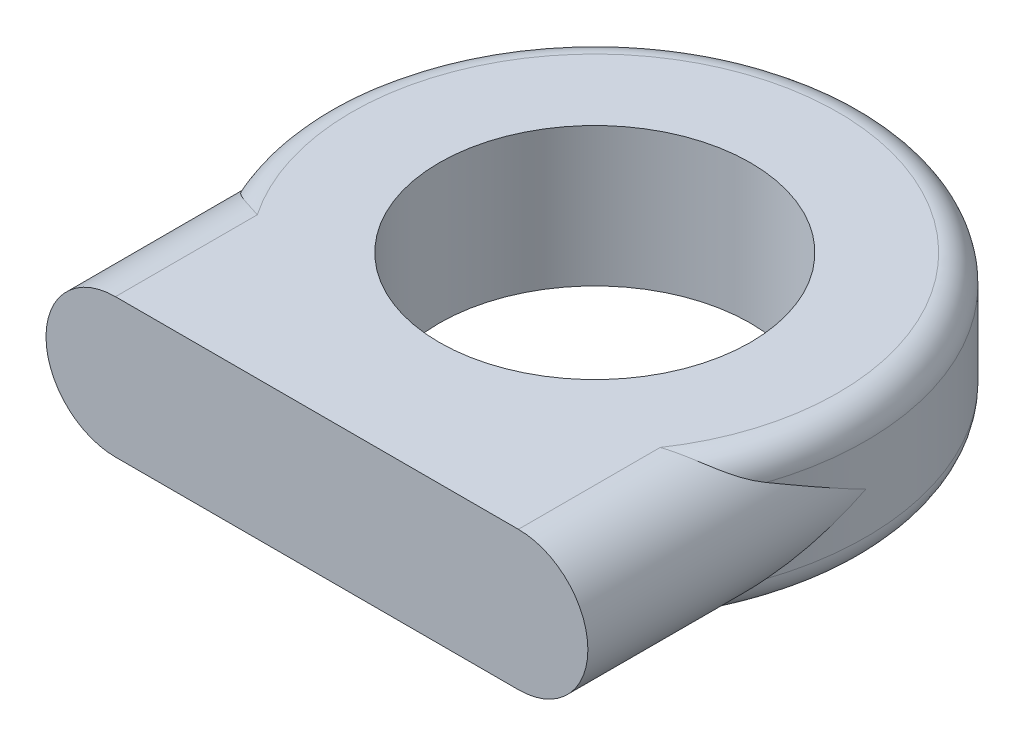
ISO-10303-21;
HEADER;
FILE_DESCRIPTION(('STEP AP214'),'2;1');
FILE_NAME('part.step','',(''),(''),'','','');
FILE_SCHEMA(('AUTOMOTIVE_DESIGN { 1 0 10303 214 1 1 1 1 }'));
ENDSEC;
DATA;
#1=APPLICATION_CONTEXT('core data for automotive mechanical design processes');
#2=APPLICATION_PROTOCOL_DEFINITION('international standard','automotive_design',2000,#1);
#3=PRODUCT_CONTEXT('',#1,'mechanical');
#4=PRODUCT('Part','Part','',(#3));
#5=PRODUCT_RELATED_PRODUCT_CATEGORY('part','',(#4));
#6=PRODUCT_DEFINITION_FORMATION('','',#4);
#7=PRODUCT_DEFINITION_CONTEXT('part definition',#1,'design');
#8=PRODUCT_DEFINITION('design','',#6,#7);
#9=PRODUCT_DEFINITION_SHAPE('','',#8);
#10=(LENGTH_UNIT() NAMED_UNIT(*) SI_UNIT(.MILLI.,.METRE.));
#11=(NAMED_UNIT(*) PLANE_ANGLE_UNIT() SI_UNIT($,.RADIAN.));
#12=(NAMED_UNIT(*) SI_UNIT($,.STERADIAN.) SOLID_ANGLE_UNIT());
#13=UNCERTAINTY_MEASURE_WITH_UNIT(LENGTH_MEASURE(1.E-05),#10,'distance_accuracy_value','');
#14=(GEOMETRIC_REPRESENTATION_CONTEXT(3) GLOBAL_UNCERTAINTY_ASSIGNED_CONTEXT((#13)) GLOBAL_UNIT_ASSIGNED_CONTEXT((#10,
#11,#12)) REPRESENTATION_CONTEXT('',''));
#15=CARTESIAN_POINT('',(0.,0.,0.));
#16=DIRECTION('',(0.,0.,1.));
#17=DIRECTION('',(1.,0.,0.));
#18=AXIS2_PLACEMENT_3D('',#15,#16,#17);
#19=CARTESIAN_POINT('',(-7.25,-2.5,10.));
#20=DIRECTION('',(0.,1.,0.));
#21=DIRECTION('',(-1.,0.,0.));
#22=AXIS2_PLACEMENT_3D('',#19,#20,#21);
#23=PLANE('',#22);
#24=CARTESIAN_POINT('',(0.,-2.5,0.));
#25=DIRECTION('',(0.,1.,0.));
#26=DIRECTION('',(-1.,0.,0.));
#27=AXIS2_PLACEMENT_3D('',#24,#25,#26);
#28=CIRCLE('',#27,5.6);
#29=CARTESIAN_POINT('',(-5.6,-2.5,0.));
#30=VERTEX_POINT('',#29);
#31=EDGE_CURVE('E223',#30,#30,#28,.T.);
#32=ORIENTED_EDGE('',*,*,#31,.T.);
#33=EDGE_LOOP('',(#32));
#34=FACE_BOUND('',#33,.T.);
#35=DIRECTION('',(0.,0.,-1.));
#36=VECTOR('',#35,1.);
#37=CARTESIAN_POINT('',(-7.25,-2.5,10.));
#38=LINE('',#37,#36);
#39=CARTESIAN_POINT('',(-7.25,-2.5,10.));
#40=VERTEX_POINT('',#39);
#41=CARTESIAN_POINT('',(-7.25,-2.5,4.89897948556636));
#42=VERTEX_POINT('',#41);
#43=EDGE_CURVE('E248',#40,#42,#38,.T.);
#44=ORIENTED_EDGE('',*,*,#43,.T.);
#45=CARTESIAN_POINT('',(0.,-2.5,0.));
#46=DIRECTION('',(0.,1.,0.));
#47=DIRECTION('',(-1.,0.,0.));
#48=AXIS2_PLACEMENT_3D('',#45,#46,#47);
#49=CIRCLE('',#48,8.75);
#50=CARTESIAN_POINT('',(7.25,-2.5,4.89897948556635));
#51=VERTEX_POINT('',#50);
#52=EDGE_CURVE('E129',#42,#51,#49,.F.);
#53=ORIENTED_EDGE('',*,*,#52,.T.);
#54=DIRECTION('',(0.,0.,-1.));
#55=VECTOR('',#54,1.);
#56=CARTESIAN_POINT('',(7.25,-2.5,10.));
#57=LINE('',#56,#55);
#58=CARTESIAN_POINT('',(7.25,-2.5,10.));
#59=VERTEX_POINT('',#58);
#60=EDGE_CURVE('E112',#59,#51,#57,.T.);
#61=ORIENTED_EDGE('',*,*,#60,.F.);
#62=DIRECTION('',(1.,0.,0.));
#63=VECTOR('',#62,1.);
#64=CARTESIAN_POINT('',(-7.25,-2.5,10.));
#65=LINE('',#64,#63);
#66=EDGE_CURVE('E118',#40,#59,#65,.T.);
#67=ORIENTED_EDGE('',*,*,#66,.F.);
#68=EDGE_LOOP('',(#44,#53,#61,#67));
#69=FACE_BOUND('',#68,.T.);
#70=ADVANCED_FACE('F43',(#34,#69),#23,.F.);
#71=CARTESIAN_POINT('',(7.25,0.,10.));
#72=DIRECTION('',(0.,0.,-1.));
#73=DIRECTION('',(-1.,0.,0.));
#74=AXIS2_PLACEMENT_3D('',#71,#72,#73);
#75=CYLINDRICAL_SURFACE('',#74,2.5);
#76=ORIENTED_EDGE('',*,*,#60,.T.);
#77=CARTESIAN_POINT('',(9.25,-1.5,3.08220700148449));
#78=CARTESIAN_POINT('',(9.22538793706788,-1.53279594283045,3.15611218495832));
#79=CARTESIAN_POINT('',(9.19850590219112,-1.56697560042796,3.22868495210433));
#80=CARTESIAN_POINT('',(9.13967070513804,-1.63745888448764,3.37077200686747));
#81=CARTESIAN_POINT('',(9.10771248421605,-1.67376460667963,3.44028315417292));
#82=CARTESIAN_POINT('',(9.03819131207329,-1.7478410825948,3.57580022551322));
#83=CARTESIAN_POINT('',(9.00062039640007,-1.78561386078442,3.64180098483077));
#84=CARTESIAN_POINT('',(8.91956848113987,-1.86161906887468,3.76975109783069));
#85=CARTESIAN_POINT('',(8.87609010654015,-1.89985128778264,3.83170223296153));
#86=CARTESIAN_POINT('',(8.78739323879114,-1.97215140787907,3.94566247140833));
#87=CARTESIAN_POINT('',(8.74271796503943,-2.00627431024821,3.99805949246989));
#88=CARTESIAN_POINT('',(8.64838578644206,-2.07312749654137,4.09912401143548));
#89=CARTESIAN_POINT('',(8.59872936155599,-2.1058579142065,4.14779186786819));
#90=CARTESIAN_POINT('',(8.49468725858401,-2.16897427489983,4.2412662075702));
#91=CARTESIAN_POINT('',(8.44030867367207,-2.19936360919489,4.28607828771912));
#92=CARTESIAN_POINT('',(8.32709130514468,-2.25696866486009,4.37194926409674));
#93=CARTESIAN_POINT('',(8.26825273823489,-2.28418454026225,4.41300834246613));
#94=CARTESIAN_POINT('',(8.14635781168631,-2.33471863001676,4.49164084364874));
#95=CARTESIAN_POINT('',(8.08328689896918,-2.35802231800548,4.52920105473039));
#96=CARTESIAN_POINT('',(7.95370738767556,-2.39988148129178,4.60087663287962));
#97=CARTESIAN_POINT('',(7.8871988959552,-2.41843710407501,4.6349921069286));
#98=CARTESIAN_POINT('',(7.75151238551278,-2.45017015311739,4.70002222962976));
#99=CARTESIAN_POINT('',(7.68233816702557,-2.46335494658461,4.73094121915715));
#100=CARTESIAN_POINT('',(7.54199412804431,-2.48390113425664,4.78997201709042));
#101=CARTESIAN_POINT('',(7.47082536235388,-2.49126554852812,4.81808527470345));
#102=CARTESIAN_POINT('',(7.35447585586255,-2.49821538510866,4.8617126516559));
#103=CARTESIAN_POINT('',(7.30967519686776,-2.49969174634017,4.87796151190939));
#104=CARTESIAN_POINT('',(7.25982157266838,-2.49998553004052,4.89553384891087));
#105=CARTESIAN_POINT('',(7.25491158826797,-2.50000000600108,4.89725905642823));
#106=CARTESIAN_POINT('',(7.25,-2.5,4.89897948556636));
#107=B_SPLINE_CURVE_WITH_KNOTS('',3,(#77,#78,#79,#80,#81,#82,#83,#84,#85,#86,#87,#88,#89,#90,
#91,#92,#93,#94,#95,#96,#97,#98,#99,#100,#101,#102,#103,#104,#105,#106),.UNSPECIFIED.,.F.,.F.,
(4,2,2,2,2,2,2,2,2,2,2,2,2,2,4),(0.,0.253553101434157,0.507360488761587,0.761531513010319,
1.01558996315215,1.24588315291135,1.47615417401061,1.70608509708787,1.93600485522517,
2.16676030185836,2.39750857983494,2.62793926404414,2.85825030420011,3.00121755548222,
3.01683029424212),.UNSPECIFIED.);
#108=CARTESIAN_POINT('',(9.25,-1.5,3.08220700148449));
#109=VERTEX_POINT('',#108);
#110=EDGE_CURVE('E158',#51,#109,#107,.F.);
#111=ORIENTED_EDGE('',*,*,#110,.T.);
#112=CARTESIAN_POINT('',(7.25,-2.5,6.51920240520265));
#113=CARTESIAN_POINT('',(7.30326609978854,-2.49999690375263,6.45996716053818));
#114=CARTESIAN_POINT('',(7.35579121433536,-2.49829804794426,6.40009165623401));
#115=CARTESIAN_POINT('',(7.45926349480197,-2.49176613289408,6.27918884262179));
#116=CARTESIAN_POINT('',(7.51021113038537,-2.48693401610637,6.21816188501696));
#117=CARTESIAN_POINT('',(7.66038713797589,-2.46814741312908,6.03374350657992));
#118=CARTESIAN_POINT('',(7.75716617065864,-2.44990054716222,5.90877244064124));
#119=CARTESIAN_POINT('',(7.94294335955738,-2.40393687354984,5.65654476760837));
#120=CARTESIAN_POINT('',(8.03199915447322,-2.37629948777414,5.52931554562343));
#121=CARTESIAN_POINT('',(8.20312988067585,-2.31297841395025,5.27210034443598));
#122=CARTESIAN_POINT('',(8.28520017770489,-2.27728944081524,5.14211260553697));
#123=CARTESIAN_POINT('',(8.48528508171737,-2.17773177247459,4.80815441330914));
#124=CARTESIAN_POINT('',(8.5983838839804,-2.10913150607275,4.60263574700664));
#125=CARTESIAN_POINT('',(8.80792646737831,-1.95945057432639,4.18772033142253));
#126=CARTESIAN_POINT('',(8.90436451399448,-1.87836562992971,3.97832227423013));
#127=CARTESIAN_POINT('',(9.08146978672393,-1.70617891425464,3.5555854649982));
#128=CARTESIAN_POINT('',(9.16205333662416,-1.61502776237464,3.34223198292668));
#129=CARTESIAN_POINT('',(9.30728654818802,-1.42542300686959,2.91344417704854));
#130=CARTESIAN_POINT('',(9.37193869729314,-1.32697054635767,2.69801018354701));
#131=CARTESIAN_POINT('',(9.48251292437025,-1.13042548441692,2.27791359018091));
#132=CARTESIAN_POINT('',(9.52929169054877,-1.03263141102199,2.07333591043872));
#133=CARTESIAN_POINT('',(9.60936731605326,-0.833606147523587,1.66320412624022));
#134=CARTESIAN_POINT('',(9.64266002470099,-0.732373909611626,1.45764974084159));
#135=CARTESIAN_POINT('',(9.7224562834451,-0.425935457044067,0.841216783236109));
#136=CARTESIAN_POINT('',(9.74924066025044,-0.217320088847361,0.429173645746177));
#137=CARTESIAN_POINT('',(9.74999469025452,-0.00594756284276196,0.0117455042167481));
#138=CARTESIAN_POINT('',(9.74999999608208,-0.00297375242368185,0.00587269946184242));
#139=CARTESIAN_POINT('',(9.75,0.,0.));
#140=B_SPLINE_CURVE_WITH_KNOTS('',3,(#112,#113,#114,#115,#116,#117,#118,#119,#120,#121,#122,
#123,#124,#125,#126,#127,#128,#129,#130,#131,#132,#133,#134,#135,#136,#137,#138,#139),
.UNSPECIFIED.,.F.,.F.,(4,2,2,2,2,2,2,2,2,2,2,2,2,4),(0.,0.23893060706027,0.477789379459564,
0.954533904211858,1.42734270442518,1.90046276547021,2.63256542496351,3.36491956934071,
4.10104091244767,4.83704724867889,5.53115763298278,6.22548148544484,7.60939091259736,
7.62913933667389),.UNSPECIFIED.);
#141=CARTESIAN_POINT('',(9.75,0.,0.));
#142=VERTEX_POINT('',#141);
#143=EDGE_CURVE('E126',#109,#142,#140,.T.);
#144=ORIENTED_EDGE('',*,*,#143,.T.);
#145=CARTESIAN_POINT('',(7.25,2.5,6.51920240520265));
#146=CARTESIAN_POINT('',(7.30326609978853,2.49999690375264,6.45996716053818));
#147=CARTESIAN_POINT('',(7.35579121433535,2.49829804794427,6.40009165623401));
#148=CARTESIAN_POINT('',(7.45926349480196,2.49176613289408,6.2791888426218));
#149=CARTESIAN_POINT('',(7.51021113038536,2.48693401610638,6.21816188501696));
#150=CARTESIAN_POINT('',(7.66038713797589,2.46814741312909,6.03374350657993));
#151=CARTESIAN_POINT('',(7.75716617065864,2.44990054716223,5.90877244064124));
#152=CARTESIAN_POINT('',(7.94294335955737,2.40393687354985,5.65654476760837));
#153=CARTESIAN_POINT('',(8.03199915447321,2.37629948777415,5.52931554562344));
#154=CARTESIAN_POINT('',(8.20312988067585,2.31297841395026,5.27210034443599));
#155=CARTESIAN_POINT('',(8.28520017770488,2.27728944081525,5.14211260553697));
#156=CARTESIAN_POINT('',(8.48528508171736,2.1777317724746,4.80815441330915));
#157=CARTESIAN_POINT('',(8.59838388398039,2.10913150607276,4.60263574700665));
#158=CARTESIAN_POINT('',(8.80792646737831,1.9594505743264,4.18772033142254));
#159=CARTESIAN_POINT('',(8.90436451399447,1.87836562992972,3.97832227423013));
#160=CARTESIAN_POINT('',(9.08146978672393,1.70617891425465,3.55558546499821));
#161=CARTESIAN_POINT('',(9.16205333662416,1.61502776237465,3.34223198292669));
#162=CARTESIAN_POINT('',(9.30728654818801,1.4254230068696,2.91344417704856));
#163=CARTESIAN_POINT('',(9.37193869729314,1.32697054635768,2.69801018354703));
#164=CARTESIAN_POINT('',(9.48251292437025,1.13042548441693,2.27791359018092));
#165=CARTESIAN_POINT('',(9.52929169054877,1.032631411022,2.07333591043874));
#166=CARTESIAN_POINT('',(9.60936731605326,0.833606147523595,1.66320412624023));
#167=CARTESIAN_POINT('',(9.64266002470099,0.732373909611633,1.4576497408416));
#168=CARTESIAN_POINT('',(9.7224562834451,0.425935457044088,0.841216783236106));
#169=CARTESIAN_POINT('',(9.74924066025044,0.217320088847415,0.429173645746155));
#170=CARTESIAN_POINT('',(9.74999469025452,0.00594756284276936,0.0117455042167471));
#171=CARTESIAN_POINT('',(9.74999999608208,0.00297375242368866,0.00587269946184192));
#172=CARTESIAN_POINT('',(9.75,0.,0.));
#173=B_SPLINE_CURVE_WITH_KNOTS('',3,(#145,#146,#147,#148,#149,#150,#151,#152,#153,#154,#155,
#156,#157,#158,#159,#160,#161,#162,#163,#164,#165,#166,#167,#168,#169,#170,#171,#172),
.UNSPECIFIED.,.F.,.F.,(4,2,2,2,2,2,2,2,2,2,2,2,2,4),(0.,0.23893060706027,0.477789379459565,
0.954533904211859,1.42734270442518,1.90046276547021,2.63256542496351,3.3649195693407,
4.10104091244766,4.83704724867888,5.53115763298277,6.22548148544484,7.60939091259737,
7.6291393366739),.UNSPECIFIED.);
#174=CARTESIAN_POINT('',(9.25,1.5,3.08220700148449));
#175=VERTEX_POINT('',#174);
#176=EDGE_CURVE('E182',#142,#175,#173,.F.);
#177=ORIENTED_EDGE('',*,*,#176,.T.);
#178=CARTESIAN_POINT('',(9.25,1.5,3.08220700148449));
#179=CARTESIAN_POINT('',(9.22538793706788,1.53279594283045,3.15611218495833));
#180=CARTESIAN_POINT('',(9.19850590219111,1.56697560042797,3.22868495210434));
#181=CARTESIAN_POINT('',(9.13967070513804,1.63745888448765,3.37077200686748));
#182=CARTESIAN_POINT('',(9.10771248421604,1.67376460667964,3.44028315417293));
#183=CARTESIAN_POINT('',(9.03819131207328,1.74784108259481,3.57580022551323));
#184=CARTESIAN_POINT('',(9.00062039640006,1.78561386078443,3.64180098483078));
#185=CARTESIAN_POINT('',(8.91956848113987,1.86161906887469,3.7697510978307));
#186=CARTESIAN_POINT('',(8.87609010654014,1.89985128778265,3.83170223296154));
#187=CARTESIAN_POINT('',(8.78739323879114,1.97215140787908,3.94566247140833));
#188=CARTESIAN_POINT('',(8.74271796503943,2.00627431024821,3.99805949246989));
#189=CARTESIAN_POINT('',(8.64838578644207,2.07312749654137,4.09912401143547));
#190=CARTESIAN_POINT('',(8.598729361556,2.1058579142065,4.14779186786819));
#191=CARTESIAN_POINT('',(8.49468725858402,2.16897427489983,4.2412662075702));
#192=CARTESIAN_POINT('',(8.44030867367207,2.19936360919489,4.28607828771912));
#193=CARTESIAN_POINT('',(8.32709130514468,2.25696866486009,4.37194926409674));
#194=CARTESIAN_POINT('',(8.26825273823489,2.28418454026225,4.41300834246613));
#195=CARTESIAN_POINT('',(8.14635781168631,2.33471863001676,4.49164084364874));
#196=CARTESIAN_POINT('',(8.08328689896918,2.35802231800549,4.52920105473039));
#197=CARTESIAN_POINT('',(7.95370738767556,2.39988148129179,4.60087663287962));
#198=CARTESIAN_POINT('',(7.8871988959552,2.41843710407501,4.6349921069286));
#199=CARTESIAN_POINT('',(7.75151238551278,2.4501701531174,4.70002222962976));
#200=CARTESIAN_POINT('',(7.68233816702557,2.46335494658462,4.73094121915714));
#201=CARTESIAN_POINT('',(7.54199412804432,2.48390113425664,4.78997201709043));
#202=CARTESIAN_POINT('',(7.4708253623539,2.49126554852813,4.81808527470349));
#203=CARTESIAN_POINT('',(7.35447585586255,2.49821538510867,4.86171265165589));
#204=CARTESIAN_POINT('',(7.30967519686775,2.49969174634018,4.87796151190934));
#205=CARTESIAN_POINT('',(7.25982157266838,2.49998553004052,4.89553384891086));
#206=CARTESIAN_POINT('',(7.25491158826796,2.50000000600108,4.89725905642822));
#207=CARTESIAN_POINT('',(7.25,2.5,4.89897948556636));
#208=B_SPLINE_CURVE_WITH_KNOTS('',3,(#178,#179,#180,#181,#182,#183,#184,#185,#186,#187,#188,
#189,#190,#191,#192,#193,#194,#195,#196,#197,#198,#199,#200,#201,#202,#203,#204,#205,#206,#207),
.UNSPECIFIED.,.F.,.F.,(4,2,2,2,2,2,2,2,2,2,2,2,2,2,4),(0.,0.253553101434168,0.50736048876161,
0.761531513010332,1.01558996315215,1.24588315291134,1.4761541740106,1.70608509708786,
1.93600485522517,2.16676030185836,2.39750857983494,2.62793926404414,2.8582503042001,
3.00121755548222,3.01683029424212),.UNSPECIFIED.);
#209=CARTESIAN_POINT('',(7.25,2.5,4.89897948556636));
#210=VERTEX_POINT('',#209);
#211=EDGE_CURVE('E11',#175,#210,#208,.T.);
#212=ORIENTED_EDGE('',*,*,#211,.T.);
#213=DIRECTION('',(0.,0.,-1.));
#214=VECTOR('',#213,1.);
#215=CARTESIAN_POINT('',(7.25,2.5,10.));
#216=LINE('',#215,#214);
#217=CARTESIAN_POINT('',(7.25,2.5,10.));
#218=VERTEX_POINT('',#217);
#219=EDGE_CURVE('E73',#218,#210,#216,.T.);
#220=ORIENTED_EDGE('',*,*,#219,.F.);
#221=CARTESIAN_POINT('',(7.25,0.,10.));
#222=DIRECTION('',(0.,0.,1.));
#223=DIRECTION('',(1.,0.,0.));
#224=AXIS2_PLACEMENT_3D('',#221,#222,#223);
#225=CIRCLE('',#224,2.5);
#226=EDGE_CURVE('E108',#59,#218,#225,.T.);
#227=ORIENTED_EDGE('',*,*,#226,.F.);
#228=EDGE_LOOP('',(#76,#111,#144,#177,#212,#220,#227));
#229=FACE_BOUND('',#228,.T.);
#230=ADVANCED_FACE('F110',(#229),#75,.T.);
#231=CARTESIAN_POINT('',(-7.25,2.5,10.));
#232=DIRECTION('',(0.,1.,0.));
#233=DIRECTION('',(-1.,0.,0.));
#234=AXIS2_PLACEMENT_3D('',#231,#232,#233);
#235=PLANE('',#234);
#236=CARTESIAN_POINT('',(0.,2.5,0.));
#237=DIRECTION('',(0.,1.,0.));
#238=DIRECTION('',(-1.,0.,0.));
#239=AXIS2_PLACEMENT_3D('',#236,#237,#238);
#240=CIRCLE('',#239,5.6);
#241=CARTESIAN_POINT('',(-5.6,2.5,0.));
#242=VERTEX_POINT('',#241);
#243=EDGE_CURVE('E226',#242,#242,#240,.T.);
#244=ORIENTED_EDGE('',*,*,#243,.F.);
#245=EDGE_LOOP('',(#244));
#246=FACE_BOUND('',#245,.T.);
#247=CARTESIAN_POINT('',(0.,2.5,0.));
#248=DIRECTION('',(0.,1.,0.));
#249=DIRECTION('',(-1.,0.,0.));
#250=AXIS2_PLACEMENT_3D('',#247,#248,#249);
#251=CIRCLE('',#250,8.75);
#252=CARTESIAN_POINT('',(-7.25,2.5,4.89897948556636));
#253=VERTEX_POINT('',#252);
#254=EDGE_CURVE('E146',#210,#253,#251,.T.);
#255=ORIENTED_EDGE('',*,*,#254,.T.);
#256=DIRECTION('',(0.,0.,-1.));
#257=VECTOR('',#256,1.);
#258=CARTESIAN_POINT('',(-7.25,2.5,10.));
#259=LINE('',#258,#257);
#260=CARTESIAN_POINT('',(-7.25,2.5,10.));
#261=VERTEX_POINT('',#260);
#262=EDGE_CURVE('E65',#261,#253,#259,.T.);
#263=ORIENTED_EDGE('',*,*,#262,.F.);
#264=DIRECTION('',(1.,0.,0.));
#265=VECTOR('',#264,1.);
#266=CARTESIAN_POINT('',(-7.25,2.5,10.));
#267=LINE('',#266,#265);
#268=EDGE_CURVE('E117',#261,#218,#267,.T.);
#269=ORIENTED_EDGE('',*,*,#268,.T.);
#270=ORIENTED_EDGE('',*,*,#219,.T.);
#271=EDGE_LOOP('',(#255,#263,#269,#270));
#272=FACE_BOUND('',#271,.T.);
#273=ADVANCED_FACE('F178',(#246,#272),#235,.T.);
#274=CARTESIAN_POINT('',(-7.25,0.,10.));
#275=DIRECTION('',(0.,0.,-1.));
#276=DIRECTION('',(-1.,0.,0.));
#277=AXIS2_PLACEMENT_3D('',#274,#275,#276);
#278=CYLINDRICAL_SURFACE('',#277,2.5);
#279=ORIENTED_EDGE('',*,*,#262,.T.);
#280=CARTESIAN_POINT('',(-9.25,1.5,3.08220700148449));
#281=CARTESIAN_POINT('',(-9.22538793706788,1.53279594283045,3.15611218495832));
#282=CARTESIAN_POINT('',(-9.19850590219112,1.56697560042796,3.22868495210433));
#283=CARTESIAN_POINT('',(-9.13967070513805,1.63745888448764,3.37077200686747));
#284=CARTESIAN_POINT('',(-9.10771248421605,1.67376460667963,3.44028315417291));
#285=CARTESIAN_POINT('',(-9.03819131207329,1.7478410825948,3.57580022551321));
#286=CARTESIAN_POINT('',(-9.00062039640007,1.78561386078442,3.64180098483077));
#287=CARTESIAN_POINT('',(-8.91956848113987,1.86161906887469,3.76975109783069));
#288=CARTESIAN_POINT('',(-8.87609010654015,1.89985128778265,3.83170223296153));
#289=CARTESIAN_POINT('',(-8.78739323879114,1.97215140787908,3.94566247140832));
#290=CARTESIAN_POINT('',(-8.74271796503943,2.00627431024821,3.99805949246989));
#291=CARTESIAN_POINT('',(-8.64838578644206,2.07312749654137,4.09912401143548));
#292=CARTESIAN_POINT('',(-8.59872936155599,2.1058579142065,4.1477918678682));
#293=CARTESIAN_POINT('',(-8.49468725858401,2.16897427489983,4.2412662075702));
#294=CARTESIAN_POINT('',(-8.44030867367207,2.19936360919489,4.28607828771912));
#295=CARTESIAN_POINT('',(-8.32709130514468,2.25696866486009,4.37194926409674));
#296=CARTESIAN_POINT('',(-8.26825273823489,2.28418454026225,4.41300834246613));
#297=CARTESIAN_POINT('',(-8.1463578116863,2.33471863001676,4.49164084364874));
#298=CARTESIAN_POINT('',(-8.08328689896917,2.35802231800549,4.52920105473039));
#299=CARTESIAN_POINT('',(-7.95370738767555,2.39988148129179,4.60087663287962));
#300=CARTESIAN_POINT('',(-7.8871988959552,2.41843710407501,4.6349921069286));
#301=CARTESIAN_POINT('',(-7.75151238551278,2.4501701531174,4.70002222962976));
#302=CARTESIAN_POINT('',(-7.68233816702557,2.46335494658462,4.73094121915715));
#303=CARTESIAN_POINT('',(-7.54199412804431,2.48390113425664,4.78997201709042));
#304=CARTESIAN_POINT('',(-7.47082536235388,2.49126554852813,4.81808527470345));
#305=CARTESIAN_POINT('',(-7.35447585586255,2.49821538510867,4.8617126516559));
#306=CARTESIAN_POINT('',(-7.30967519686776,2.49969174634017,4.87796151190939));
#307=CARTESIAN_POINT('',(-7.25982157266838,2.49998553004052,4.89553384891087));
#308=CARTESIAN_POINT('',(-7.25491158826797,2.50000000600108,4.89725905642823));
#309=CARTESIAN_POINT('',(-7.25,2.5,4.89897948556636));
#310=B_SPLINE_CURVE_WITH_KNOTS('',3,(#280,#281,#282,#283,#284,#285,#286,#287,#288,#289,#290,
#291,#292,#293,#294,#295,#296,#297,#298,#299,#300,#301,#302,#303,#304,#305,#306,#307,#308,#309),
.UNSPECIFIED.,.F.,.F.,(4,2,2,2,2,2,2,2,2,2,2,2,2,2,4),(0.,0.253553101434157,0.507360488761587,
0.761531513010321,1.01558996315215,1.24588315291135,1.47615417401061,1.70608509708787,
1.93600485522517,2.16676030185836,2.39750857983494,2.62793926404415,2.85825030420012,
3.00121755548223,3.01683029424212),.UNSPECIFIED.);
#311=CARTESIAN_POINT('',(-9.25,1.5,3.08220700148449));
#312=VERTEX_POINT('',#311);
#313=EDGE_CURVE('E58',#253,#312,#310,.F.);
#314=ORIENTED_EDGE('',*,*,#313,.T.);
#315=CARTESIAN_POINT('',(-7.25,2.5,6.51920240520265));
#316=CARTESIAN_POINT('',(-7.30326609978853,2.49999690375264,6.45996716053818));
#317=CARTESIAN_POINT('',(-7.35579121433535,2.49829804794427,6.40009165623401));
#318=CARTESIAN_POINT('',(-7.45926349480196,2.49176613289408,6.2791888426218));
#319=CARTESIAN_POINT('',(-7.51021113038537,2.48693401610637,6.21816188501696));
#320=CARTESIAN_POINT('',(-7.66038713797589,2.46814741312909,6.03374350657993));
#321=CARTESIAN_POINT('',(-7.75716617065864,2.44990054716223,5.90877244064124));
#322=CARTESIAN_POINT('',(-7.94294335955737,2.40393687354984,5.65654476760837));
#323=CARTESIAN_POINT('',(-8.03199915447322,2.37629948777415,5.52931554562344));
#324=CARTESIAN_POINT('',(-8.20312988067585,2.31297841395026,5.27210034443599));
#325=CARTESIAN_POINT('',(-8.28520017770489,2.27728944081524,5.14211260553697));
#326=CARTESIAN_POINT('',(-8.48528508171737,2.1777317724746,4.80815441330914));
#327=CARTESIAN_POINT('',(-8.5983838839804,2.10913150607276,4.60263574700665));
#328=CARTESIAN_POINT('',(-8.80792646737831,1.95945057432639,4.18772033142253));
#329=CARTESIAN_POINT('',(-8.90436451399448,1.87836562992971,3.97832227423013));
#330=CARTESIAN_POINT('',(-9.08146978672393,1.70617891425465,3.5555854649982));
#331=CARTESIAN_POINT('',(-9.16205333662416,1.61502776237464,3.34223198292668));
#332=CARTESIAN_POINT('',(-9.30728654818802,1.4254230068696,2.91344417704855));
#333=CARTESIAN_POINT('',(-9.37193869729314,1.32697054635767,2.69801018354701));
#334=CARTESIAN_POINT('',(-9.48251292437025,1.13042548441692,2.27791359018091));
#335=CARTESIAN_POINT('',(-9.52929169054877,1.03263141102199,2.07333591043873));
#336=CARTESIAN_POINT('',(-9.60936731605326,0.83360614752359,1.66320412624022));
#337=CARTESIAN_POINT('',(-9.64266002470099,0.732373909611635,1.45764974084159));
#338=CARTESIAN_POINT('',(-9.7224562834451,0.425935457044058,0.841216783236115));
#339=CARTESIAN_POINT('',(-9.74924066025044,0.217320088847289,0.429173645746216));
#340=CARTESIAN_POINT('',(-9.74999469025452,0.00594756284276229,0.0117455042167488));
#341=CARTESIAN_POINT('',(-9.74999999608208,0.00297375242368333,0.00587269946184275));
#342=CARTESIAN_POINT('',(-9.75,0.,0.));
#343=B_SPLINE_CURVE_WITH_KNOTS('',3,(#315,#316,#317,#318,#319,#320,#321,#322,#323,#324,#325,
#326,#327,#328,#329,#330,#331,#332,#333,#334,#335,#336,#337,#338,#339,#340,#341,#342),
.UNSPECIFIED.,.F.,.F.,(4,2,2,2,2,2,2,2,2,2,2,2,2,4),(0.,0.238930607060269,0.477789379459564,
0.954533904211856,1.42734270442518,1.90046276547021,2.63256542496351,3.36491956934071,
4.10104091244767,4.8370472486789,5.53115763298278,6.22548148544484,7.60939091259737,
7.62913933667389),.UNSPECIFIED.);
#344=CARTESIAN_POINT('',(-9.75,0.,0.));
#345=VERTEX_POINT('',#344);
#346=EDGE_CURVE('E211',#312,#345,#343,.T.);
#347=ORIENTED_EDGE('',*,*,#346,.T.);
#348=CARTESIAN_POINT('',(-7.25,-2.5,6.51920240520265));
#349=CARTESIAN_POINT('',(-7.30326609978853,-2.49999690375264,6.45996716053818));
#350=CARTESIAN_POINT('',(-7.35579121433535,-2.49829804794427,6.40009165623401));
#351=CARTESIAN_POINT('',(-7.45926349480196,-2.49176613289408,6.2791888426218));
#352=CARTESIAN_POINT('',(-7.51021113038537,-2.48693401610637,6.21816188501696));
#353=CARTESIAN_POINT('',(-7.66038713797589,-2.46814741312909,6.03374350657993));
#354=CARTESIAN_POINT('',(-7.75716617065864,-2.44990054716223,5.90877244064125));
#355=CARTESIAN_POINT('',(-7.94294335955737,-2.40393687354984,5.65654476760838));
#356=CARTESIAN_POINT('',(-8.03199915447321,-2.37629948777415,5.52931554562344));
#357=CARTESIAN_POINT('',(-8.20312988067585,-2.31297841395026,5.27210034443599));
#358=CARTESIAN_POINT('',(-8.28520017770489,-2.27728944081524,5.14211260553697));
#359=CARTESIAN_POINT('',(-8.48528508171737,-2.1777317724746,4.80815441330914));
#360=CARTESIAN_POINT('',(-8.5983838839804,-2.10913150607276,4.60263574700665));
#361=CARTESIAN_POINT('',(-8.80792646737831,-1.95945057432639,4.18772033142254));
#362=CARTESIAN_POINT('',(-8.90436451399448,-1.87836562992972,3.97832227423013));
#363=CARTESIAN_POINT('',(-9.08146978672393,-1.70617891425465,3.5555854649982));
#364=CARTESIAN_POINT('',(-9.16205333662416,-1.61502776237464,3.34223198292669));
#365=CARTESIAN_POINT('',(-9.30728654818802,-1.4254230068696,2.91344417704855));
#366=CARTESIAN_POINT('',(-9.37193869729314,-1.32697054635767,2.69801018354702));
#367=CARTESIAN_POINT('',(-9.48251292437025,-1.13042548441692,2.27791359018091));
#368=CARTESIAN_POINT('',(-9.52929169054877,-1.03263141102199,2.07333591043873));
#369=CARTESIAN_POINT('',(-9.60936731605326,-0.833606147523594,1.66320412624023));
#370=CARTESIAN_POINT('',(-9.64266002470099,-0.732373909611638,1.45764974084159));
#371=CARTESIAN_POINT('',(-9.7224562834451,-0.425935457044052,0.841216783236121));
#372=CARTESIAN_POINT('',(-9.74924066025044,-0.217320088847271,0.429173645746227));
#373=CARTESIAN_POINT('',(-9.74999469025452,-0.0059475628427628,0.0117455042167494));
#374=CARTESIAN_POINT('',(-9.74999999608208,-0.00297375242368402,0.00587269946184306));
#375=CARTESIAN_POINT('',(-9.75,0.,0.));
#376=B_SPLINE_CURVE_WITH_KNOTS('',3,(#348,#349,#350,#351,#352,#353,#354,#355,#356,#357,#358,
#359,#360,#361,#362,#363,#364,#365,#366,#367,#368,#369,#370,#371,#372,#373,#374,#375),
.UNSPECIFIED.,.F.,.F.,(4,2,2,2,2,2,2,2,2,2,2,2,2,4),(0.,0.238930607060269,0.477789379459562,
0.954533904211854,1.42734270442518,1.90046276547021,2.63256542496351,3.36491956934071,
4.10104091244767,4.83704724867889,5.53115763298278,6.22548148544484,7.60939091259737,
7.62913933667389),.UNSPECIFIED.);
#377=CARTESIAN_POINT('',(-9.25,-1.5,3.08220700148449));
#378=VERTEX_POINT('',#377);
#379=EDGE_CURVE('E204',#345,#378,#376,.F.);
#380=ORIENTED_EDGE('',*,*,#379,.T.);
#381=CARTESIAN_POINT('',(-9.25,-1.5,3.08220700148449));
#382=CARTESIAN_POINT('',(-9.22538793706788,-1.53279594283045,3.15611218495832));
#383=CARTESIAN_POINT('',(-9.19850590219111,-1.56697560042797,3.22868495210434));
#384=CARTESIAN_POINT('',(-9.13967070513804,-1.63745888448765,3.37077200686748));
#385=CARTESIAN_POINT('',(-9.10771248421604,-1.67376460667964,3.44028315417293));
#386=CARTESIAN_POINT('',(-9.03819131207328,-1.74784108259481,3.57580022551323));
#387=CARTESIAN_POINT('',(-9.00062039640007,-1.78561386078443,3.64180098483078));
#388=CARTESIAN_POINT('',(-8.91956848113987,-1.86161906887469,3.7697510978307));
#389=CARTESIAN_POINT('',(-8.87609010654014,-1.89985128778265,3.83170223296154));
#390=CARTESIAN_POINT('',(-8.78739323879114,-1.97215140787908,3.94566247140833));
#391=CARTESIAN_POINT('',(-8.74271796503943,-2.00627431024821,3.99805949246989));
#392=CARTESIAN_POINT('',(-8.64838578644207,-2.07312749654137,4.09912401143548));
#393=CARTESIAN_POINT('',(-8.598729361556,-2.10585791420649,4.14779186786819));
#394=CARTESIAN_POINT('',(-8.49468725858402,-2.16897427489983,4.2412662075702));
#395=CARTESIAN_POINT('',(-8.44030867367207,-2.19936360919488,4.28607828771912));
#396=CARTESIAN_POINT('',(-8.32709130514468,-2.25696866486009,4.37194926409674));
#397=CARTESIAN_POINT('',(-8.26825273823489,-2.28418454026225,4.41300834246613));
#398=CARTESIAN_POINT('',(-8.14635781168631,-2.33471863001676,4.49164084364874));
#399=CARTESIAN_POINT('',(-8.08328689896918,-2.35802231800549,4.52920105473039));
#400=CARTESIAN_POINT('',(-7.95370738767556,-2.39988148129179,4.60087663287962));
#401=CARTESIAN_POINT('',(-7.8871988959552,-2.41843710407501,4.6349921069286));
#402=CARTESIAN_POINT('',(-7.75151238551278,-2.4501701531174,4.70002222962976));
#403=CARTESIAN_POINT('',(-7.68233816702557,-2.46335494658462,4.73094121915713));
#404=CARTESIAN_POINT('',(-7.54199412804432,-2.48390113425664,4.78997201709043));
#405=CARTESIAN_POINT('',(-7.4708253623539,-2.49126554852813,4.81808527470349));
#406=CARTESIAN_POINT('',(-7.35447585586255,-2.49821538510867,4.86171265165589));
#407=CARTESIAN_POINT('',(-7.30967519686775,-2.49969174634017,4.87796151190934));
#408=CARTESIAN_POINT('',(-7.25982157266838,-2.49998553004052,4.89553384891086));
#409=CARTESIAN_POINT('',(-7.25491158826796,-2.50000000600108,4.89725905642822));
#410=CARTESIAN_POINT('',(-7.25,-2.5,4.89897948556636));
#411=B_SPLINE_CURVE_WITH_KNOTS('',3,(#381,#382,#383,#384,#385,#386,#387,#388,#389,#390,#391,
#392,#393,#394,#395,#396,#397,#398,#399,#400,#401,#402,#403,#404,#405,#406,#407,#408,#409,#410),
.UNSPECIFIED.,.F.,.F.,(4,2,2,2,2,2,2,2,2,2,2,2,2,2,4),(0.,0.253553101434168,0.507360488761609,
0.761531513010331,1.01558996315215,1.24588315291134,1.4761541740106,1.70608509708786,
1.93600485522517,2.16676030185835,2.39750857983494,2.62793926404414,2.8582503042001,
3.00121755548222,3.01683029424212),.UNSPECIFIED.);
#412=EDGE_CURVE('E149',#378,#42,#411,.T.);
#413=ORIENTED_EDGE('',*,*,#412,.T.);
#414=ORIENTED_EDGE('',*,*,#43,.F.);
#415=CARTESIAN_POINT('',(-7.25,0.,10.));
#416=DIRECTION('',(0.,0.,1.));
#417=DIRECTION('',(1.,0.,0.));
#418=AXIS2_PLACEMENT_3D('',#415,#416,#417);
#419=CIRCLE('',#418,2.5);
#420=EDGE_CURVE('E122',#261,#40,#419,.T.);
#421=ORIENTED_EDGE('',*,*,#420,.F.);
#422=EDGE_LOOP('',(#279,#314,#347,#380,#413,#414,#421));
#423=FACE_BOUND('',#422,.T.);
#424=ADVANCED_FACE('F163',(#423),#278,.T.);
#425=CARTESIAN_POINT('',(7.25,0.,10.));
#426=DIRECTION('',(0.,0.,1.));
#427=DIRECTION('',(1.,0.,0.));
#428=AXIS2_PLACEMENT_3D('',#425,#426,#427);
#429=PLANE('',#428);
#430=ORIENTED_EDGE('',*,*,#66,.T.);
#431=ORIENTED_EDGE('',*,*,#226,.T.);
#432=ORIENTED_EDGE('',*,*,#268,.F.);
#433=ORIENTED_EDGE('',*,*,#420,.T.);
#434=EDGE_LOOP('',(#430,#431,#432,#433));
#435=FACE_BOUND('',#434,.T.);
#436=ADVANCED_FACE('F121',(#435),#429,.T.);
#437=CARTESIAN_POINT('',(0.,-2.5,0.));
#438=DIRECTION('',(0.,1.,0.));
#439=DIRECTION('',(-1.,0.,0.));
#440=AXIS2_PLACEMENT_3D('',#437,#438,#439);
#441=CYLINDRICAL_SURFACE('',#440,9.75);
#442=ORIENTED_EDGE('',*,*,#143,.F.);
#443=CARTESIAN_POINT('',(0.,-1.5,0.));
#444=DIRECTION('',(0.,1.,0.));
#445=DIRECTION('',(-1.,0.,0.));
#446=AXIS2_PLACEMENT_3D('',#443,#444,#445);
#447=CIRCLE('',#446,9.75);
#448=EDGE_CURVE('E136',#109,#378,#447,.T.);
#449=ORIENTED_EDGE('',*,*,#448,.T.);
#450=ORIENTED_EDGE('',*,*,#379,.F.);
#451=ORIENTED_EDGE('',*,*,#346,.F.);
#452=CARTESIAN_POINT('',(0.,1.5,0.));
#453=DIRECTION('',(0.,1.,0.));
#454=DIRECTION('',(-1.,0.,0.));
#455=AXIS2_PLACEMENT_3D('',#452,#453,#454);
#456=CIRCLE('',#455,9.75);
#457=EDGE_CURVE('E132',#312,#175,#456,.F.);
#458=ORIENTED_EDGE('',*,*,#457,.T.);
#459=ORIENTED_EDGE('',*,*,#176,.F.);
#460=EDGE_LOOP('',(#442,#449,#450,#451,#458,#459));
#461=FACE_BOUND('',#460,.T.);
#462=ADVANCED_FACE('F171',(#461),#441,.T.);
#463=CARTESIAN_POINT('',(0.,-1.5,0.));
#464=DIRECTION('',(0.,1.,0.));
#465=DIRECTION('',(-1.,0.,0.));
#466=AXIS2_PLACEMENT_3D('',#463,#464,#465);
#467=TOROIDAL_SURFACE('',#466,8.75,1.);
#468=ORIENTED_EDGE('',*,*,#110,.F.);
#469=ORIENTED_EDGE('',*,*,#52,.F.);
#470=ORIENTED_EDGE('',*,*,#412,.F.);
#471=ORIENTED_EDGE('',*,*,#448,.F.);
#472=EDGE_LOOP('',(#468,#469,#470,#471));
#473=FACE_BOUND('',#472,.T.);
#474=ADVANCED_FACE('F167',(#473),#467,.T.);
#475=CARTESIAN_POINT('',(0.,1.5,0.));
#476=DIRECTION('',(0.,1.,0.));
#477=DIRECTION('',(-1.,0.,0.));
#478=AXIS2_PLACEMENT_3D('',#475,#476,#477);
#479=TOROIDAL_SURFACE('',#478,8.75,1.);
#480=ORIENTED_EDGE('',*,*,#211,.F.);
#481=ORIENTED_EDGE('',*,*,#457,.F.);
#482=ORIENTED_EDGE('',*,*,#313,.F.);
#483=ORIENTED_EDGE('',*,*,#254,.F.);
#484=EDGE_LOOP('',(#480,#481,#482,#483));
#485=FACE_BOUND('',#484,.T.);
#486=ADVANCED_FACE('F45',(#485),#479,.T.);
#487=CARTESIAN_POINT('',(0.,-2.5,0.));
#488=DIRECTION('',(0.,1.,0.));
#489=DIRECTION('',(-1.,0.,0.));
#490=AXIS2_PLACEMENT_3D('',#487,#488,#489);
#491=CYLINDRICAL_SURFACE('',#490,5.6);
#492=ORIENTED_EDGE('',*,*,#31,.F.);
#493=EDGE_LOOP('',(#492));
#494=FACE_BOUND('',#493,.T.);
#495=ORIENTED_EDGE('',*,*,#243,.T.);
#496=EDGE_LOOP('',(#495));
#497=FACE_BOUND('',#496,.T.);
#498=ADVANCED_FACE('F200',(#494,#497),#491,.F.);
#499=CLOSED_SHELL('',(#70,#230,#273,#424,#436,#462,#474,#486,#498));
#500=MANIFOLD_SOLID_BREP('B2',#499);
#501=ADVANCED_BREP_SHAPE_REPRESENTATION('',(#18,#500),#14);
#502=SHAPE_DEFINITION_REPRESENTATION(#9,#501);
ENDSEC;
END-ISO-10303-21;
